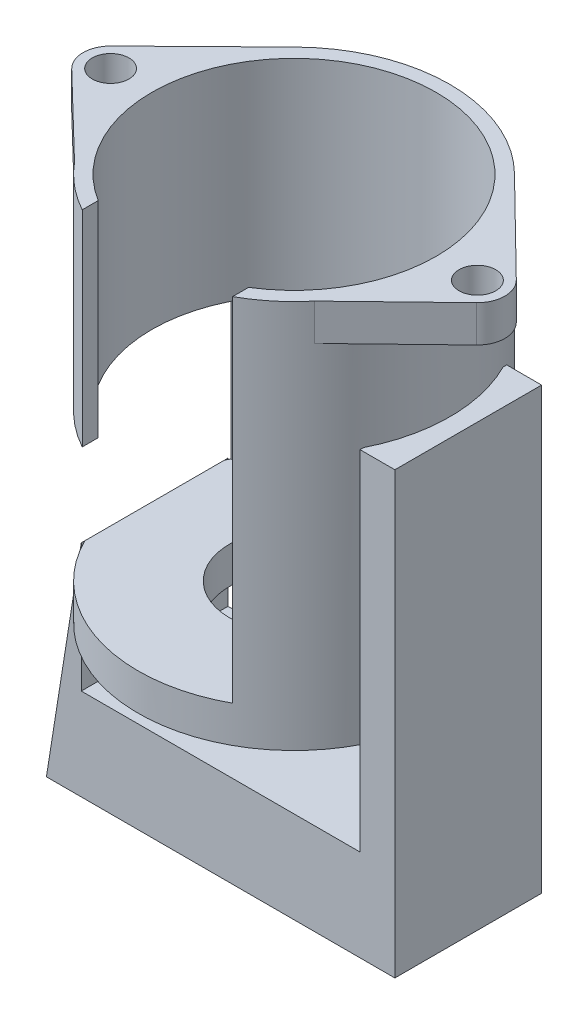
ISO-10303-21;
HEADER;
FILE_DESCRIPTION(('STEP AP214'),'2;1');
FILE_NAME('part.step','',(''),(''),'','','');
FILE_SCHEMA(('AUTOMOTIVE_DESIGN { 1 0 10303 214 1 1 1 1 }'));
ENDSEC;
DATA;
#1=APPLICATION_CONTEXT('core data for automotive mechanical design processes');
#2=APPLICATION_PROTOCOL_DEFINITION('international standard','automotive_design',2000,#1);
#3=PRODUCT_CONTEXT('',#1,'mechanical');
#4=PRODUCT('Part','Part','',(#3));
#5=PRODUCT_RELATED_PRODUCT_CATEGORY('part','',(#4));
#6=PRODUCT_DEFINITION_FORMATION('','',#4);
#7=PRODUCT_DEFINITION_CONTEXT('part definition',#1,'design');
#8=PRODUCT_DEFINITION('design','',#6,#7);
#9=PRODUCT_DEFINITION_SHAPE('','',#8);
#10=(LENGTH_UNIT() NAMED_UNIT(*) SI_UNIT(.MILLI.,.METRE.));
#11=(NAMED_UNIT(*) PLANE_ANGLE_UNIT() SI_UNIT($,.RADIAN.));
#12=(NAMED_UNIT(*) SI_UNIT($,.STERADIAN.) SOLID_ANGLE_UNIT());
#13=UNCERTAINTY_MEASURE_WITH_UNIT(LENGTH_MEASURE(1.E-05),#10,'distance_accuracy_value','');
#14=(GEOMETRIC_REPRESENTATION_CONTEXT(3) GLOBAL_UNCERTAINTY_ASSIGNED_CONTEXT((#13)) GLOBAL_UNIT_ASSIGNED_CONTEXT((#10,
#11,#12)) REPRESENTATION_CONTEXT('',''));
#15=CARTESIAN_POINT('',(0.,0.,0.));
#16=DIRECTION('',(0.,0.,1.));
#17=DIRECTION('',(1.,0.,0.));
#18=AXIS2_PLACEMENT_3D('',#15,#16,#17);
#19=CARTESIAN_POINT('',(0.,22.201,0.));
#20=DIRECTION('',(0.,-1.,0.));
#21=DIRECTION('',(0.,0.,-1.));
#22=AXIS2_PLACEMENT_3D('',#19,#20,#21);
#23=CYLINDRICAL_SURFACE('',#22,7.75);
#24=CARTESIAN_POINT('',(0.,1.,0.));
#25=DIRECTION('',(0.,1.,0.));
#26=DIRECTION('',(0.,0.,1.));
#27=AXIS2_PLACEMENT_3D('',#24,#25,#26);
#28=CIRCLE('',#27,7.75);
#29=CARTESIAN_POINT('',(-7.5,1.,-1.95256241897666));
#30=VERTEX_POINT('',#29);
#31=CARTESIAN_POINT('',(-7.5,1.,1.95256241897666));
#32=VERTEX_POINT('',#31);
#33=EDGE_CURVE('E255',#30,#32,#28,.T.);
#34=ORIENTED_EDGE('',*,*,#33,.T.);
#35=DIRECTION('',(0.,-1.,0.));
#36=VECTOR('',#35,1.);
#37=CARTESIAN_POINT('',(-7.5,22.201,1.95256241897666));
#38=LINE('',#37,#36);
#39=CARTESIAN_POINT('',(-7.5,0.,1.95256241897666));
#40=VERTEX_POINT('',#39);
#41=EDGE_CURVE('E292',#32,#40,#38,.T.);
#42=ORIENTED_EDGE('',*,*,#41,.T.);
#43=CARTESIAN_POINT('',(0.,0.,0.));
#44=DIRECTION('',(0.,1.,0.));
#45=DIRECTION('',(0.,0.,1.));
#46=AXIS2_PLACEMENT_3D('',#43,#44,#45);
#47=CIRCLE('',#46,7.75);
#48=CARTESIAN_POINT('',(-7.6,0.,1.51739909054935));
#49=VERTEX_POINT('',#48);
#50=EDGE_CURVE('E556',#49,#40,#47,.T.);
#51=ORIENTED_EDGE('',*,*,#50,.F.);
#52=CARTESIAN_POINT('',(-7.6,0.,-1.51739909054935));
#53=VERTEX_POINT('',#52);
#54=EDGE_CURVE('E562',#53,#49,#47,.T.);
#55=ORIENTED_EDGE('',*,*,#54,.F.);
#56=CARTESIAN_POINT('',(-7.5,0.,-1.95256241897666));
#57=VERTEX_POINT('',#56);
#58=EDGE_CURVE('E561',#57,#53,#47,.T.);
#59=ORIENTED_EDGE('',*,*,#58,.F.);
#60=DIRECTION('',(0.,-1.,0.));
#61=VECTOR('',#60,1.);
#62=CARTESIAN_POINT('',(-7.5,22.201,-1.95256241897666));
#63=LINE('',#62,#61);
#64=EDGE_CURVE('E269',#57,#30,#63,.F.);
#65=ORIENTED_EDGE('',*,*,#64,.T.);
#66=EDGE_LOOP('',(#34,#42,#51,#55,#59,#65));
#67=FACE_BOUND('',#66,.T.);
#68=ADVANCED_FACE('F39',(#67),#23,.F.);
#69=CARTESIAN_POINT('',(0.,22.2,0.));
#70=DIRECTION('',(0.,-1.,0.));
#71=DIRECTION('',(0.,0.,-1.));
#72=AXIS2_PLACEMENT_3D('',#69,#70,#71);
#73=CYLINDRICAL_SURFACE('',#72,8.5);
#74=CARTESIAN_POINT('',(0.,1.,0.));
#75=DIRECTION('',(0.,1.,0.));
#76=DIRECTION('',(0.,0.,1.));
#77=AXIS2_PLACEMENT_3D('',#74,#75,#76);
#78=CIRCLE('',#77,8.5);
#79=CARTESIAN_POINT('',(-7.5,1.,4.));
#80=VERTEX_POINT('',#79);
#81=CARTESIAN_POINT('',(7.6,1.,3.80657326213486));
#82=VERTEX_POINT('',#81);
#83=EDGE_CURVE('E315',#80,#82,#78,.T.);
#84=ORIENTED_EDGE('',*,*,#83,.T.);
#85=DIRECTION('',(0.,-1.,0.));
#86=VECTOR('',#85,1.);
#87=CARTESIAN_POINT('',(7.6,15.,3.80657326213486));
#88=LINE('',#87,#86);
#89=CARTESIAN_POINT('',(7.6,15.,3.80657326213486));
#90=VERTEX_POINT('',#89);
#91=EDGE_CURVE('E370',#90,#82,#88,.T.);
#92=ORIENTED_EDGE('',*,*,#91,.F.);
#93=CARTESIAN_POINT('',(0.,15.,0.));
#94=DIRECTION('',(0.,-1.,0.));
#95=DIRECTION('',(0.,0.,1.));
#96=AXIS2_PLACEMENT_3D('',#93,#94,#95);
#97=CIRCLE('',#96,8.5);
#98=CARTESIAN_POINT('',(7.6,15.,-3.80657326213486));
#99=VERTEX_POINT('',#98);
#100=EDGE_CURVE('E334',#99,#90,#97,.T.);
#101=ORIENTED_EDGE('',*,*,#100,.F.);
#102=DIRECTION('',(0.,-1.,0.));
#103=VECTOR('',#102,1.);
#104=CARTESIAN_POINT('',(7.6,15.,-3.80657326213486));
#105=LINE('',#104,#103);
#106=CARTESIAN_POINT('',(7.6,1.,-3.80657326213486));
#107=VERTEX_POINT('',#106);
#108=EDGE_CURVE('E275',#99,#107,#105,.T.);
#109=ORIENTED_EDGE('',*,*,#108,.T.);
#110=CARTESIAN_POINT('',(0.,1.,0.));
#111=DIRECTION('',(0.,1.,0.));
#112=DIRECTION('',(0.,0.,1.));
#113=AXIS2_PLACEMENT_3D('',#110,#111,#112);
#114=CIRCLE('',#113,8.5);
#115=CARTESIAN_POINT('',(-7.5,1.,-4.));
#116=VERTEX_POINT('',#115);
#117=EDGE_CURVE('E251',#107,#116,#114,.T.);
#118=ORIENTED_EDGE('',*,*,#117,.T.);
#119=DIRECTION('',(0.,-1.,0.));
#120=VECTOR('',#119,1.);
#121=CARTESIAN_POINT('',(-7.5,1.,-4.));
#122=LINE('',#121,#120);
#123=CARTESIAN_POINT('',(-7.5,0.,-4.));
#124=VERTEX_POINT('',#123);
#125=EDGE_CURVE('E262',#116,#124,#122,.T.);
#126=ORIENTED_EDGE('',*,*,#125,.T.);
#127=CARTESIAN_POINT('',(0.,0.,0.));
#128=DIRECTION('',(0.,1.,0.));
#129=DIRECTION('',(0.,0.,1.));
#130=AXIS2_PLACEMENT_3D('',#127,#128,#129);
#131=CIRCLE('',#130,8.5);
#132=CARTESIAN_POINT('',(-7.6,0.,-3.80657326213486));
#133=VERTEX_POINT('',#132);
#134=EDGE_CURVE('E572',#124,#133,#131,.T.);
#135=ORIENTED_EDGE('',*,*,#134,.T.);
#136=DIRECTION('',(0.,-1.,0.));
#137=VECTOR('',#136,1.);
#138=CARTESIAN_POINT('',(-7.6,3.,-3.80657326213486));
#139=LINE('',#138,#137);
#140=CARTESIAN_POINT('',(-7.6,3.,-3.80657326213486));
#141=VERTEX_POINT('',#140);
#142=EDGE_CURVE('E383',#141,#133,#139,.T.);
#143=ORIENTED_EDGE('',*,*,#142,.F.);
#144=CARTESIAN_POINT('',(0.,3.,0.));
#145=DIRECTION('',(0.,-1.,0.));
#146=DIRECTION('',(0.,0.,-1.));
#147=AXIS2_PLACEMENT_3D('',#144,#145,#146);
#148=CIRCLE('',#147,8.5);
#149=CARTESIAN_POINT('',(-7.47411703846161,3.,-4.0481569257352));
#150=VERTEX_POINT('',#149);
#151=EDGE_CURVE('E392',#141,#150,#148,.T.);
#152=ORIENTED_EDGE('',*,*,#151,.T.);
#153=DIRECTION('',(0.,-1.,0.));
#154=VECTOR('',#153,1.);
#155=CARTESIAN_POINT('',(-7.47411703846161,22.2,-4.0481569257352));
#156=LINE('',#155,#154);
#157=CARTESIAN_POINT('',(-7.47411703846161,11.,-4.0481569257352));
#158=VERTEX_POINT('',#157);
#159=EDGE_CURVE('E48',#150,#158,#156,.F.);
#160=ORIENTED_EDGE('',*,*,#159,.T.);
#161=CARTESIAN_POINT('',(0.,11.,0.));
#162=DIRECTION('',(0.,1.,0.));
#163=DIRECTION('',(0.,0.,1.));
#164=AXIS2_PLACEMENT_3D('',#161,#162,#163);
#165=CIRCLE('',#164,8.5);
#166=CARTESIAN_POINT('',(-4.1,11.,7.44580418759452));
#167=VERTEX_POINT('',#166);
#168=EDGE_CURVE('E400',#158,#167,#165,.T.);
#169=ORIENTED_EDGE('',*,*,#168,.T.);
#170=DIRECTION('',(0.,-1.,0.));
#171=VECTOR('',#170,1.);
#172=CARTESIAN_POINT('',(-4.1,22.2,7.44580418759451));
#173=LINE('',#172,#171);
#174=CARTESIAN_POINT('',(-4.1,22.2,7.44580418759451));
#175=VERTEX_POINT('',#174);
#176=EDGE_CURVE('E415',#175,#167,#173,.T.);
#177=ORIENTED_EDGE('',*,*,#176,.F.);
#178=CARTESIAN_POINT('',(0.,22.2,0.));
#179=DIRECTION('',(0.,1.,0.));
#180=DIRECTION('',(0.,0.,1.));
#181=AXIS2_PLACEMENT_3D('',#178,#179,#180);
#182=CIRCLE('',#181,8.5);
#183=CARTESIAN_POINT('',(-6.54868791660348,22.2,5.41891931762521));
#184=VERTEX_POINT('',#183);
#185=EDGE_CURVE('E563',#184,#175,#182,.T.);
#186=ORIENTED_EDGE('',*,*,#185,.F.);
#187=DIRECTION('',(0.,1.,0.));
#188=VECTOR('',#187,1.);
#189=CARTESIAN_POINT('',(-6.54868791660351,20.2,5.41891931762517));
#190=LINE('',#189,#188);
#191=CARTESIAN_POINT('',(-6.54868791660351,20.2,5.41891931762517));
#192=VERTEX_POINT('',#191);
#193=EDGE_CURVE('E547',#192,#184,#190,.T.);
#194=ORIENTED_EDGE('',*,*,#193,.F.);
#195=CARTESIAN_POINT('',(0.,20.2,0.));
#196=DIRECTION('',(0.,1.,0.));
#197=DIRECTION('',(0.,0.,1.));
#198=AXIS2_PLACEMENT_3D('',#195,#196,#197);
#199=CIRCLE('',#198,8.5);
#200=CARTESIAN_POINT('',(-5.95,20.2,-6.07021416426142));
#201=VERTEX_POINT('',#200);
#202=EDGE_CURVE('E528',#201,#192,#199,.T.);
#203=ORIENTED_EDGE('',*,*,#202,.F.);
#204=DIRECTION('',(0.,1.,0.));
#205=VECTOR('',#204,1.);
#206=CARTESIAN_POINT('',(-5.95,20.2,-6.07021416426142));
#207=LINE('',#206,#205);
#208=CARTESIAN_POINT('',(-5.95,22.2,-6.07021416426142));
#209=VERTEX_POINT('',#208);
#210=EDGE_CURVE('E529',#201,#209,#207,.T.);
#211=ORIENTED_EDGE('',*,*,#210,.T.);
#212=CARTESIAN_POINT('',(5.94999999999996,22.2,-6.07021416426146));
#213=VERTEX_POINT('',#212);
#214=EDGE_CURVE('E567',#213,#209,#182,.T.);
#215=ORIENTED_EDGE('',*,*,#214,.F.);
#216=DIRECTION('',(0.,1.,0.));
#217=VECTOR('',#216,1.);
#218=CARTESIAN_POINT('',(5.94999999999996,20.2,-6.07021416426146));
#219=LINE('',#218,#217);
#220=CARTESIAN_POINT('',(5.94999999999996,20.2,-6.07021416426146));
#221=VERTEX_POINT('',#220);
#222=EDGE_CURVE('E533',#221,#213,#219,.T.);
#223=ORIENTED_EDGE('',*,*,#222,.F.);
#224=CARTESIAN_POINT('',(6.54868791660355,20.2,5.41891931762513));
#225=VERTEX_POINT('',#224);
#226=EDGE_CURVE('E555',#225,#221,#199,.T.);
#227=ORIENTED_EDGE('',*,*,#226,.F.);
#228=DIRECTION('',(0.,1.,0.));
#229=VECTOR('',#228,1.);
#230=CARTESIAN_POINT('',(6.54868791660355,20.2,5.41891931762513));
#231=LINE('',#230,#229);
#232=CARTESIAN_POINT('',(6.54868791660355,22.2,5.41891931762513));
#233=VERTEX_POINT('',#232);
#234=EDGE_CURVE('E543',#225,#233,#231,.T.);
#235=ORIENTED_EDGE('',*,*,#234,.T.);
#236=CARTESIAN_POINT('',(4.1,22.2,7.44580418759452));
#237=VERTEX_POINT('',#236);
#238=EDGE_CURVE('E568',#237,#233,#182,.T.);
#239=ORIENTED_EDGE('',*,*,#238,.F.);
#240=DIRECTION('',(0.,-1.,0.));
#241=VECTOR('',#240,1.);
#242=CARTESIAN_POINT('',(4.1,22.2,7.44580418759452));
#243=LINE('',#242,#241);
#244=CARTESIAN_POINT('',(4.1,3.,7.44580418759451));
#245=VERTEX_POINT('',#244);
#246=EDGE_CURVE('E63',#245,#237,#243,.F.);
#247=ORIENTED_EDGE('',*,*,#246,.F.);
#248=CARTESIAN_POINT('',(-7.6,3.,3.80657326213486));
#249=VERTEX_POINT('',#248);
#250=EDGE_CURVE('E396',#245,#249,#148,.T.);
#251=ORIENTED_EDGE('',*,*,#250,.T.);
#252=DIRECTION('',(0.,-1.,0.));
#253=VECTOR('',#252,1.);
#254=CARTESIAN_POINT('',(-7.6,3.,3.80657326213486));
#255=LINE('',#254,#253);
#256=CARTESIAN_POINT('',(-7.6,0.,3.80657326213486));
#257=VERTEX_POINT('',#256);
#258=EDGE_CURVE('E380',#249,#257,#255,.T.);
#259=ORIENTED_EDGE('',*,*,#258,.T.);
#260=CARTESIAN_POINT('',(-7.5,0.,4.));
#261=VERTEX_POINT('',#260);
#262=EDGE_CURVE('E560',#257,#261,#131,.T.);
#263=ORIENTED_EDGE('',*,*,#262,.T.);
#264=DIRECTION('',(0.,-1.,0.));
#265=VECTOR('',#264,1.);
#266=CARTESIAN_POINT('',(-7.5,1.,4.));
#267=LINE('',#266,#265);
#268=EDGE_CURVE('E55',#80,#261,#267,.T.);
#269=ORIENTED_EDGE('',*,*,#268,.F.);
#270=EDGE_LOOP('',(#84,#92,#101,#109,#118,#126,#135,#143,#152,#160,#169,#177,#186,#194,#203,
#211,#215,#223,#227,#235,#239,#247,#251,#259,#263,#269));
#271=FACE_BOUND('',#270,.T.);
#272=ADVANCED_FACE('F272',(#271),#73,.T.);
#273=CARTESIAN_POINT('',(0.,0.,0.));
#274=DIRECTION('',(0.,1.,0.));
#275=DIRECTION('',(0.,0.,1.));
#276=AXIS2_PLACEMENT_3D('',#273,#274,#275);
#277=PLANE('',#276);
#278=DIRECTION('',(0.,0.,1.));
#279=VECTOR('',#278,1.);
#280=CARTESIAN_POINT('',(-7.5,0.,4.));
#281=LINE('',#280,#279);
#282=EDGE_CURVE('E281',#40,#261,#281,.T.);
#283=ORIENTED_EDGE('',*,*,#282,.T.);
#284=ORIENTED_EDGE('',*,*,#262,.F.);
#285=DIRECTION('',(0.,0.,1.));
#286=VECTOR('',#285,1.);
#287=CARTESIAN_POINT('',(-7.6,0.,-4.));
#288=LINE('',#287,#286);
#289=EDGE_CURVE('E423',#49,#257,#288,.T.);
#290=ORIENTED_EDGE('',*,*,#289,.F.);
#291=ORIENTED_EDGE('',*,*,#50,.T.);
#292=EDGE_LOOP('',(#283,#284,#290,#291));
#293=FACE_BOUND('',#292,.T.);
#294=ADVANCED_FACE('F655',(#293),#277,.F.);
#295=EDGE_CURVE('E265',#124,#57,#281,.T.);
#296=ORIENTED_EDGE('',*,*,#295,.T.);
#297=ORIENTED_EDGE('',*,*,#58,.T.);
#298=EDGE_CURVE('E429',#133,#53,#288,.T.);
#299=ORIENTED_EDGE('',*,*,#298,.F.);
#300=ORIENTED_EDGE('',*,*,#134,.F.);
#301=EDGE_LOOP('',(#296,#297,#299,#300));
#302=FACE_BOUND('',#301,.T.);
#303=ADVANCED_FACE('F666',(#302),#277,.F.);
#304=CARTESIAN_POINT('',(-4.1,22.2,8.5));
#305=DIRECTION('',(1.,0.,0.));
#306=DIRECTION('',(0.,1.,0.));
#307=AXIS2_PLACEMENT_3D('',#304,#305,#306);
#308=PLANE('',#307);
#309=DIRECTION('',(0.,0.,1.));
#310=VECTOR('',#309,1.);
#311=CARTESIAN_POINT('',(-4.1,11.,8.5));
#312=LINE('',#311,#310);
#313=CARTESIAN_POINT('',(-4.1,11.,6.57666328771665));
#314=VERTEX_POINT('',#313);
#315=EDGE_CURVE('E608',#314,#167,#312,.T.);
#316=ORIENTED_EDGE('',*,*,#315,.F.);
#317=DIRECTION('',(0.,-1.,0.));
#318=VECTOR('',#317,1.);
#319=CARTESIAN_POINT('',(-4.1,22.201,6.57666328771665));
#320=LINE('',#319,#318);
#321=CARTESIAN_POINT('',(-4.1,22.2,6.57666328771665));
#322=VERTEX_POINT('',#321);
#323=EDGE_CURVE('E419',#322,#314,#320,.T.);
#324=ORIENTED_EDGE('',*,*,#323,.F.);
#325=DIRECTION('',(0.,0.,-1.));
#326=VECTOR('',#325,1.);
#327=CARTESIAN_POINT('',(-4.1,22.2,0.));
#328=LINE('',#327,#326);
#329=EDGE_CURVE('E604',#175,#322,#328,.T.);
#330=ORIENTED_EDGE('',*,*,#329,.F.);
#331=ORIENTED_EDGE('',*,*,#176,.T.);
#332=EDGE_LOOP('',(#316,#324,#330,#331));
#333=FACE_BOUND('',#332,.T.);
#334=ADVANCED_FACE('F636',(#333),#308,.T.);
#335=CARTESIAN_POINT('',(0.,3.,0.));
#336=DIRECTION('',(0.,1.,0.));
#337=DIRECTION('',(0.,0.,1.));
#338=AXIS2_PLACEMENT_3D('',#335,#336,#337);
#339=CIRCLE('',#338,7.75);
#340=CARTESIAN_POINT('',(4.1,3.,6.57666328771665));
#341=VERTEX_POINT('',#340);
#342=CARTESIAN_POINT('',(-6.60870074255312,3.,-4.0481569257352));
#343=VERTEX_POINT('',#342);
#344=EDGE_CURVE('E322',#341,#343,#339,.T.);
#345=ORIENTED_EDGE('',*,*,#344,.F.);
#346=DIRECTION('',(0.,-1.,0.));
#347=VECTOR('',#346,1.);
#348=CARTESIAN_POINT('',(4.1,22.201,6.57666328771665));
#349=LINE('',#348,#347);
#350=CARTESIAN_POINT('',(4.1,22.2,6.57666328771665));
#351=VERTEX_POINT('',#350);
#352=EDGE_CURVE('E412',#341,#351,#349,.F.);
#353=ORIENTED_EDGE('',*,*,#352,.T.);
#354=CARTESIAN_POINT('',(0.,22.2,0.));
#355=DIRECTION('',(0.,1.,0.));
#356=DIRECTION('',(0.,0.,1.));
#357=AXIS2_PLACEMENT_3D('',#354,#355,#356);
#358=CIRCLE('',#357,7.75);
#359=EDGE_CURVE('E448',#351,#322,#358,.T.);
#360=ORIENTED_EDGE('',*,*,#359,.T.);
#361=ORIENTED_EDGE('',*,*,#323,.T.);
#362=CARTESIAN_POINT('',(0.,11.,0.));
#363=DIRECTION('',(0.,1.,0.));
#364=DIRECTION('',(0.,0.,1.));
#365=AXIS2_PLACEMENT_3D('',#362,#363,#364);
#366=CIRCLE('',#365,7.75);
#367=CARTESIAN_POINT('',(-6.60870074255312,11.,-4.0481569257352));
#368=VERTEX_POINT('',#367);
#369=EDGE_CURVE('E404',#368,#314,#366,.T.);
#370=ORIENTED_EDGE('',*,*,#369,.F.);
#371=DIRECTION('',(0.,-1.,0.));
#372=VECTOR('',#371,1.);
#373=CARTESIAN_POINT('',(-6.60870074255312,22.201,-4.0481569257352));
#374=LINE('',#373,#372);
#375=EDGE_CURVE('E407',#343,#368,#374,.F.);
#376=ORIENTED_EDGE('',*,*,#375,.F.);
#377=EDGE_LOOP('',(#345,#353,#360,#361,#370,#376));
#378=FACE_BOUND('',#377,.T.);
#379=ADVANCED_FACE('F627',(#378),#23,.F.);
#380=CARTESIAN_POINT('',(0.,22.2,0.));
#381=DIRECTION('',(0.,1.,0.));
#382=DIRECTION('',(0.,0.,1.));
#383=AXIS2_PLACEMENT_3D('',#380,#381,#382);
#384=PLANE('',#383);
#385=CARTESIAN_POINT('',(-10.,22.2,0.));
#386=DIRECTION('',(0.,1.,0.));
#387=DIRECTION('',(0.,0.,1.));
#388=AXIS2_PLACEMENT_3D('',#385,#386,#387);
#389=CIRCLE('',#388,1.);
#390=CARTESIAN_POINT('',(-10.,22.2,1.));
#391=VERTEX_POINT('',#390);
#392=EDGE_CURVE('E467',#391,#391,#389,.T.);
#393=ORIENTED_EDGE('',*,*,#392,.F.);
#394=EDGE_LOOP('',(#393));
#395=FACE_BOUND('',#394,.T.);
#396=CARTESIAN_POINT('',(10.,22.2,0.));
#397=DIRECTION('',(0.,1.,0.));
#398=DIRECTION('',(0.,0.,-1.));
#399=AXIS2_PLACEMENT_3D('',#396,#397,#398);
#400=CIRCLE('',#399,1.);
#401=CARTESIAN_POINT('',(10.,22.2,-1.00000000000007));
#402=VERTEX_POINT('',#401);
#403=EDGE_CURVE('E462',#402,#402,#400,.T.);
#404=ORIENTED_EDGE('',*,*,#403,.F.);
#405=EDGE_LOOP('',(#404));
#406=FACE_BOUND('',#405,.T.);
#407=ORIENTED_EDGE('',*,*,#185,.T.);
#408=ORIENTED_EDGE('',*,*,#329,.T.);
#409=ORIENTED_EDGE('',*,*,#359,.F.);
#410=DIRECTION('',(0.,0.,1.));
#411=VECTOR('',#410,1.);
#412=CARTESIAN_POINT('',(4.1,22.2,0.));
#413=LINE('',#412,#411);
#414=EDGE_CURVE('E601',#351,#237,#413,.T.);
#415=ORIENTED_EDGE('',*,*,#414,.T.);
#416=ORIENTED_EDGE('',*,*,#238,.T.);
#417=DIRECTION('',(0.719277358310852,0.,-0.69472302525637));
#418=VECTOR('',#417,1.);
#419=CARTESIAN_POINT('',(11.0420845378846,22.2,1.07891603746628));
#420=LINE('',#419,#418);
#421=CARTESIAN_POINT('',(11.0420845378845,22.2,1.07891603746626));
#422=VERTEX_POINT('',#421);
#423=EDGE_CURVE('E511',#233,#422,#420,.T.);
#424=ORIENTED_EDGE('',*,*,#423,.T.);
#425=CARTESIAN_POINT('',(10.,22.2,0.));
#426=DIRECTION('',(0.,1.,0.));
#427=DIRECTION('',(0.,0.,-1.));
#428=AXIS2_PLACEMENT_3D('',#425,#426,#427);
#429=CIRCLE('',#428,1.50000000000002);
#430=CARTESIAN_POINT('',(11.05,22.2,-1.0712142642815));
#431=VERTEX_POINT('',#430);
#432=EDGE_CURVE('E515',#422,#431,#429,.T.);
#433=ORIENTED_EDGE('',*,*,#432,.T.);
#434=DIRECTION('',(-0.71414284285429,0.,-0.699999999999995));
#435=VECTOR('',#434,1.);
#436=CARTESIAN_POINT('',(11.05,22.2,-1.0712142642815));
#437=LINE('',#436,#435);
#438=EDGE_CURVE('E519',#431,#213,#437,.T.);
#439=ORIENTED_EDGE('',*,*,#438,.T.);
#440=ORIENTED_EDGE('',*,*,#214,.T.);
#441=DIRECTION('',(-0.714142842854285,0.,0.7));
#442=VECTOR('',#441,1.);
#443=CARTESIAN_POINT('',(-11.05,22.2,-1.07121426428143));
#444=LINE('',#443,#442);
#445=CARTESIAN_POINT('',(-11.05,22.2,-1.07121426428143));
#446=VERTEX_POINT('',#445);
#447=EDGE_CURVE('E484',#209,#446,#444,.T.);
#448=ORIENTED_EDGE('',*,*,#447,.T.);
#449=CARTESIAN_POINT('',(-10.,22.2,0.));
#450=DIRECTION('',(0.,1.,0.));
#451=DIRECTION('',(0.,0.,1.));
#452=AXIS2_PLACEMENT_3D('',#449,#450,#451);
#453=CIRCLE('',#452,1.5);
#454=CARTESIAN_POINT('',(-11.0420845378846,22.2,1.07891603746628));
#455=VERTEX_POINT('',#454);
#456=EDGE_CURVE('E475',#446,#455,#453,.T.);
#457=ORIENTED_EDGE('',*,*,#456,.T.);
#458=DIRECTION('',(0.719277358310851,0.,0.69472302525637));
#459=VECTOR('',#458,1.);
#460=CARTESIAN_POINT('',(-11.0420845378846,22.2,1.07891603746628));
#461=LINE('',#460,#459);
#462=EDGE_CURVE('E508',#455,#184,#461,.T.);
#463=ORIENTED_EDGE('',*,*,#462,.T.);
#464=EDGE_LOOP('',(#407,#408,#409,#415,#416,#424,#433,#439,#440,#448,#457,#463));
#465=FACE_BOUND('',#464,.T.);
#466=ADVANCED_FACE('F633',(#395,#406,#465),#384,.T.);
#467=CARTESIAN_POINT('',(0.,0.,0.));
#468=DIRECTION('',(0.,1.,0.));
#469=DIRECTION('',(0.,0.,1.));
#470=AXIS2_PLACEMENT_3D('',#467,#468,#469);
#471=PLANE('',#470);
#472=DIRECTION('',(0.,0.,-1.));
#473=VECTOR('',#472,1.);
#474=CARTESIAN_POINT('',(7.6,0.,0.));
#475=LINE('',#474,#473);
#476=CARTESIAN_POINT('',(7.6,0.,3.80657326213486));
#477=VERTEX_POINT('',#476);
#478=CARTESIAN_POINT('',(7.6,0.,-3.80657326213486));
#479=VERTEX_POINT('',#478);
#480=EDGE_CURVE('E598',#477,#479,#475,.T.);
#481=ORIENTED_EDGE('',*,*,#480,.F.);
#482=CARTESIAN_POINT('',(0.,0.,0.));
#483=DIRECTION('',(0.,1.,0.));
#484=DIRECTION('',(0.,0.,1.));
#485=AXIS2_PLACEMENT_3D('',#482,#483,#484);
#486=CIRCLE('',#485,8.5);
#487=EDGE_CURVE('E284',#477,#479,#486,.T.);
#488=ORIENTED_EDGE('',*,*,#487,.T.);
#489=EDGE_LOOP('',(#481,#488));
#490=FACE_BOUND('',#489,.T.);
#491=ADVANCED_FACE('F664',(#490),#471,.T.);
#492=CARTESIAN_POINT('',(9.50000000000001,-9.,-4.));
#493=DIRECTION('',(1.,0.,0.));
#494=DIRECTION('',(0.,0.,-1.));
#495=AXIS2_PLACEMENT_3D('',#492,#493,#494);
#496=PLANE('',#495);
#497=DIRECTION('',(0.,1.,0.));
#498=VECTOR('',#497,1.);
#499=CARTESIAN_POINT('',(9.50000000000001,-9.,-4.));
#500=LINE('',#499,#498);
#501=CARTESIAN_POINT('',(9.50000000000001,-9.,-4.));
#502=VERTEX_POINT('',#501);
#503=CARTESIAN_POINT('',(9.50000000000001,15.,-4.));
#504=VERTEX_POINT('',#503);
#505=EDGE_CURVE('E588',#502,#504,#500,.T.);
#506=ORIENTED_EDGE('',*,*,#505,.T.);
#507=DIRECTION('',(0.,0.,-1.));
#508=VECTOR('',#507,1.);
#509=CARTESIAN_POINT('',(9.50000000000001,15.,4.));
#510=LINE('',#509,#508);
#511=CARTESIAN_POINT('',(9.50000000000001,15.,4.));
#512=VERTEX_POINT('',#511);
#513=EDGE_CURVE('E357',#512,#504,#510,.T.);
#514=ORIENTED_EDGE('',*,*,#513,.F.);
#515=DIRECTION('',(0.,1.,0.));
#516=VECTOR('',#515,1.);
#517=CARTESIAN_POINT('',(9.50000000000001,-9.,4.));
#518=LINE('',#517,#516);
#519=CARTESIAN_POINT('',(9.50000000000001,-9.,4.));
#520=VERTEX_POINT('',#519);
#521=EDGE_CURVE('E589',#520,#512,#518,.T.);
#522=ORIENTED_EDGE('',*,*,#521,.F.);
#523=DIRECTION('',(0.,0.,-1.));
#524=VECTOR('',#523,1.);
#525=CARTESIAN_POINT('',(9.50000000000001,-9.,-4.));
#526=LINE('',#525,#524);
#527=EDGE_CURVE('E573',#520,#502,#526,.T.);
#528=ORIENTED_EDGE('',*,*,#527,.T.);
#529=EDGE_LOOP('',(#506,#514,#522,#528));
#530=FACE_BOUND('',#529,.T.);
#531=ADVANCED_FACE('F41',(#530),#496,.T.);
#532=CARTESIAN_POINT('',(-9.5,-9.,4.));
#533=DIRECTION('',(0.,0.,1.));
#534=DIRECTION('',(1.,0.,0.));
#535=AXIS2_PLACEMENT_3D('',#532,#533,#534);
#536=PLANE('',#535);
#537=DIRECTION('',(0.156385221956874,0.987696138674997,0.));
#538=VECTOR('',#537,1.);
#539=CARTESIAN_POINT('',(-9.5,-9.,4.));
#540=LINE('',#539,#538);
#541=CARTESIAN_POINT('',(-9.5,-9.,4.));
#542=VERTEX_POINT('',#541);
#543=CARTESIAN_POINT('',(-7.6,3.,4.));
#544=VERTEX_POINT('',#543);
#545=EDGE_CURVE('E307',#542,#544,#540,.T.);
#546=ORIENTED_EDGE('',*,*,#545,.F.);
#547=DIRECTION('',(1.,0.,0.));
#548=VECTOR('',#547,1.);
#549=CARTESIAN_POINT('',(-9.5,-9.,4.));
#550=LINE('',#549,#548);
#551=EDGE_CURVE('E584',#542,#520,#550,.T.);
#552=ORIENTED_EDGE('',*,*,#551,.T.);
#553=ORIENTED_EDGE('',*,*,#521,.T.);
#554=DIRECTION('',(1.,0.,0.));
#555=VECTOR('',#554,1.);
#556=CARTESIAN_POINT('',(7.6,15.,4.));
#557=LINE('',#556,#555);
#558=CARTESIAN_POINT('',(7.6,15.,4.));
#559=VERTEX_POINT('',#558);
#560=EDGE_CURVE('E353',#559,#512,#557,.T.);
#561=ORIENTED_EDGE('',*,*,#560,.F.);
#562=DIRECTION('',(0.,1.,0.));
#563=VECTOR('',#562,1.);
#564=CARTESIAN_POINT('',(7.6,-4.,4.));
#565=LINE('',#564,#563);
#566=CARTESIAN_POINT('',(7.6,-4.,4.));
#567=VERTEX_POINT('',#566);
#568=EDGE_CURVE('E445',#567,#559,#565,.T.);
#569=ORIENTED_EDGE('',*,*,#568,.F.);
#570=DIRECTION('',(1.,0.,0.));
#571=VECTOR('',#570,1.);
#572=CARTESIAN_POINT('',(-7.6,-4.,4.));
#573=LINE('',#572,#571);
#574=CARTESIAN_POINT('',(-7.6,-4.,4.));
#575=VERTEX_POINT('',#574);
#576=EDGE_CURVE('E437',#575,#567,#573,.T.);
#577=ORIENTED_EDGE('',*,*,#576,.F.);
#578=DIRECTION('',(0.,1.,0.));
#579=VECTOR('',#578,1.);
#580=CARTESIAN_POINT('',(-7.6,-4.,4.));
#581=LINE('',#580,#579);
#582=EDGE_CURVE('E449',#575,#544,#581,.T.);
#583=ORIENTED_EDGE('',*,*,#582,.T.);
#584=EDGE_LOOP('',(#546,#552,#553,#561,#569,#577,#583));
#585=FACE_BOUND('',#584,.T.);
#586=ADVANCED_FACE('F739',(#585),#536,.T.);
#587=CARTESIAN_POINT('',(-9.5,-9.,-4.));
#588=DIRECTION('',(0.,0.,-1.));
#589=DIRECTION('',(-1.,0.,0.));
#590=AXIS2_PLACEMENT_3D('',#587,#588,#589);
#591=PLANE('',#590);
#592=DIRECTION('',(-0.156385221956874,-0.987696138674997,0.));
#593=VECTOR('',#592,1.);
#594=CARTESIAN_POINT('',(-9.5,-9.,-4.));
#595=LINE('',#594,#593);
#596=CARTESIAN_POINT('',(-7.6,3.,-4.));
#597=VERTEX_POINT('',#596);
#598=CARTESIAN_POINT('',(-9.5,-9.,-4.));
#599=VERTEX_POINT('',#598);
#600=EDGE_CURVE('E304',#597,#599,#595,.T.);
#601=ORIENTED_EDGE('',*,*,#600,.F.);
#602=DIRECTION('',(0.,1.,0.));
#603=VECTOR('',#602,1.);
#604=CARTESIAN_POINT('',(-7.6,-4.,-4.));
#605=LINE('',#604,#603);
#606=CARTESIAN_POINT('',(-7.6,-4.,-4.));
#607=VERTEX_POINT('',#606);
#608=EDGE_CURVE('E453',#607,#597,#605,.T.);
#609=ORIENTED_EDGE('',*,*,#608,.F.);
#610=DIRECTION('',(-1.,0.,0.));
#611=VECTOR('',#610,1.);
#612=CARTESIAN_POINT('',(-7.6,-4.,-4.));
#613=LINE('',#612,#611);
#614=CARTESIAN_POINT('',(7.6,-4.,-4.));
#615=VERTEX_POINT('',#614);
#616=EDGE_CURVE('E428',#615,#607,#613,.T.);
#617=ORIENTED_EDGE('',*,*,#616,.F.);
#618=DIRECTION('',(0.,1.,0.));
#619=VECTOR('',#618,1.);
#620=CARTESIAN_POINT('',(7.6,-4.,-4.));
#621=LINE('',#620,#619);
#622=CARTESIAN_POINT('',(7.6,15.,-4.));
#623=VERTEX_POINT('',#622);
#624=EDGE_CURVE('E441',#615,#623,#621,.T.);
#625=ORIENTED_EDGE('',*,*,#624,.T.);
#626=DIRECTION('',(-1.,0.,0.));
#627=VECTOR('',#626,1.);
#628=CARTESIAN_POINT('',(9.50000000000001,15.,-4.));
#629=LINE('',#628,#627);
#630=EDGE_CURVE('E361',#504,#623,#629,.T.);
#631=ORIENTED_EDGE('',*,*,#630,.F.);
#632=ORIENTED_EDGE('',*,*,#505,.F.);
#633=DIRECTION('',(-1.,0.,0.));
#634=VECTOR('',#633,1.);
#635=CARTESIAN_POINT('',(-9.5,-9.,-4.));
#636=LINE('',#635,#634);
#637=EDGE_CURVE('E577',#502,#599,#636,.T.);
#638=ORIENTED_EDGE('',*,*,#637,.T.);
#639=EDGE_LOOP('',(#601,#609,#617,#625,#631,#632,#638));
#640=FACE_BOUND('',#639,.T.);
#641=ADVANCED_FACE('F730',(#640),#591,.T.);
#642=CARTESIAN_POINT('',(0.,-9.,0.));
#643=DIRECTION('',(0.,1.,0.));
#644=DIRECTION('',(0.,0.,1.));
#645=AXIS2_PLACEMENT_3D('',#642,#643,#644);
#646=PLANE('',#645);
#647=CARTESIAN_POINT('',(-6.,-9.,0.));
#648=DIRECTION('',(0.,1.,0.));
#649=DIRECTION('',(0.,0.,1.));
#650=AXIS2_PLACEMENT_3D('',#647,#648,#649);
#651=CIRCLE('',#650,1.);
#652=CARTESIAN_POINT('',(-6.,-9.,1.));
#653=VERTEX_POINT('',#652);
#654=EDGE_CURVE('E330',#653,#653,#651,.T.);
#655=ORIENTED_EDGE('',*,*,#654,.T.);
#656=EDGE_LOOP('',(#655));
#657=FACE_BOUND('',#656,.T.);
#658=CARTESIAN_POINT('',(6.,-9.,0.));
#659=DIRECTION('',(0.,1.,0.));
#660=DIRECTION('',(0.,0.,-1.));
#661=AXIS2_PLACEMENT_3D('',#658,#659,#660);
#662=CIRCLE('',#661,0.999999999999998);
#663=CARTESIAN_POINT('',(6.,-9.,-0.999999999999997));
#664=VERTEX_POINT('',#663);
#665=EDGE_CURVE('E339',#664,#664,#662,.T.);
#666=ORIENTED_EDGE('',*,*,#665,.T.);
#667=EDGE_LOOP('',(#666));
#668=FACE_BOUND('',#667,.T.);
#669=ORIENTED_EDGE('',*,*,#527,.F.);
#670=ORIENTED_EDGE('',*,*,#551,.F.);
#671=DIRECTION('',(0.,0.,1.));
#672=VECTOR('',#671,1.);
#673=CARTESIAN_POINT('',(-9.5,-9.,-4.));
#674=LINE('',#673,#672);
#675=EDGE_CURVE('E581',#599,#542,#674,.T.);
#676=ORIENTED_EDGE('',*,*,#675,.F.);
#677=ORIENTED_EDGE('',*,*,#637,.F.);
#678=EDGE_LOOP('',(#669,#670,#676,#677));
#679=FACE_BOUND('',#678,.T.);
#680=ADVANCED_FACE('F725',(#657,#668,#679),#646,.F.);
#681=DIRECTION('',(0.,0.,1.));
#682=VECTOR('',#681,1.);
#683=CARTESIAN_POINT('',(-7.6,0.,0.));
#684=LINE('',#683,#682);
#685=EDGE_CURVE('E594',#53,#49,#684,.T.);
#686=ORIENTED_EDGE('',*,*,#685,.F.);
#687=ORIENTED_EDGE('',*,*,#54,.T.);
#688=EDGE_LOOP('',(#686,#687));
#689=FACE_BOUND('',#688,.T.);
#690=ADVANCED_FACE('F696',(#689),#471,.T.);
#691=CARTESIAN_POINT('',(-10.,20.2,0.));
#692=DIRECTION('',(0.,1.,0.));
#693=DIRECTION('',(0.,0.,1.));
#694=AXIS2_PLACEMENT_3D('',#691,#692,#693);
#695=CYLINDRICAL_SURFACE('',#694,1.);
#696=CARTESIAN_POINT('',(-10.,20.2,0.));
#697=DIRECTION('',(0.,1.,0.));
#698=DIRECTION('',(0.,0.,1.));
#699=AXIS2_PLACEMENT_3D('',#696,#697,#698);
#700=CIRCLE('',#699,1.);
#701=CARTESIAN_POINT('',(-10.,20.2,1.));
#702=VERTEX_POINT('',#701);
#703=EDGE_CURVE('E471',#702,#702,#700,.T.);
#704=ORIENTED_EDGE('',*,*,#703,.F.);
#705=EDGE_LOOP('',(#704));
#706=FACE_BOUND('',#705,.T.);
#707=ORIENTED_EDGE('',*,*,#392,.T.);
#708=EDGE_LOOP('',(#707));
#709=FACE_BOUND('',#708,.T.);
#710=ADVANCED_FACE('F692',(#706,#709),#695,.F.);
#711=CARTESIAN_POINT('',(-10.,20.2,0.));
#712=DIRECTION('',(0.,1.,0.));
#713=DIRECTION('',(0.,0.,1.));
#714=AXIS2_PLACEMENT_3D('',#711,#712,#713);
#715=CYLINDRICAL_SURFACE('',#714,1.5);
#716=ORIENTED_EDGE('',*,*,#456,.F.);
#717=DIRECTION('',(0.,1.,0.));
#718=VECTOR('',#717,1.);
#719=CARTESIAN_POINT('',(-11.05,20.2,-1.07121426428143));
#720=LINE('',#719,#718);
#721=CARTESIAN_POINT('',(-11.05,20.2,-1.07121426428143));
#722=VERTEX_POINT('',#721);
#723=EDGE_CURVE('E525',#722,#446,#720,.T.);
#724=ORIENTED_EDGE('',*,*,#723,.F.);
#725=CARTESIAN_POINT('',(-10.,20.2,0.));
#726=DIRECTION('',(0.,1.,0.));
#727=DIRECTION('',(0.,0.,1.));
#728=AXIS2_PLACEMENT_3D('',#725,#726,#727);
#729=CIRCLE('',#728,1.5);
#730=CARTESIAN_POINT('',(-11.0420845378846,20.2,1.07891603746628));
#731=VERTEX_POINT('',#730);
#732=EDGE_CURVE('E479',#722,#731,#729,.T.);
#733=ORIENTED_EDGE('',*,*,#732,.T.);
#734=DIRECTION('',(0.,1.,0.));
#735=VECTOR('',#734,1.);
#736=CARTESIAN_POINT('',(-11.0420845378846,20.2,1.07891603746628));
#737=LINE('',#736,#735);
#738=EDGE_CURVE('E504',#731,#455,#737,.T.);
#739=ORIENTED_EDGE('',*,*,#738,.T.);
#740=EDGE_LOOP('',(#716,#724,#733,#739));
#741=FACE_BOUND('',#740,.T.);
#742=ADVANCED_FACE('F695',(#741),#715,.T.);
#743=CARTESIAN_POINT('',(-10.,20.2,0.));
#744=DIRECTION('',(0.,1.,0.));
#745=DIRECTION('',(0.,0.,1.));
#746=AXIS2_PLACEMENT_3D('',#743,#744,#745);
#747=PLANE('',#746);
#748=ORIENTED_EDGE('',*,*,#703,.T.);
#749=EDGE_LOOP('',(#748));
#750=FACE_BOUND('',#749,.T.);
#751=DIRECTION('',(-0.714142842854285,0.,0.7));
#752=VECTOR('',#751,1.);
#753=CARTESIAN_POINT('',(-11.05,20.2,-1.07121426428143));
#754=LINE('',#753,#752);
#755=EDGE_CURVE('E500',#201,#722,#754,.T.);
#756=ORIENTED_EDGE('',*,*,#755,.F.);
#757=ORIENTED_EDGE('',*,*,#202,.T.);
#758=DIRECTION('',(0.719277358310851,0.,0.69472302525637));
#759=VECTOR('',#758,1.);
#760=CARTESIAN_POINT('',(-11.0420845378846,20.2,1.07891603746628));
#761=LINE('',#760,#759);
#762=EDGE_CURVE('E483',#731,#192,#761,.T.);
#763=ORIENTED_EDGE('',*,*,#762,.F.);
#764=ORIENTED_EDGE('',*,*,#732,.F.);
#765=EDGE_LOOP('',(#756,#757,#763,#764));
#766=FACE_BOUND('',#765,.T.);
#767=ADVANCED_FACE('F698',(#750,#766),#747,.F.);
#768=CARTESIAN_POINT('',(-11.0420845378846,20.2,1.07891603746628));
#769=DIRECTION('',(-0.69472302525637,0.,0.719277358310851));
#770=DIRECTION('',(0.719277358310851,0.,0.69472302525637));
#771=AXIS2_PLACEMENT_3D('',#768,#769,#770);
#772=PLANE('',#771);
#773=ORIENTED_EDGE('',*,*,#462,.F.);
#774=ORIENTED_EDGE('',*,*,#738,.F.);
#775=ORIENTED_EDGE('',*,*,#762,.T.);
#776=ORIENTED_EDGE('',*,*,#193,.T.);
#777=EDGE_LOOP('',(#773,#774,#775,#776));
#778=FACE_BOUND('',#777,.T.);
#779=ADVANCED_FACE('F701',(#778),#772,.T.);
#780=CARTESIAN_POINT('',(-11.05,20.2,-1.07121426428143));
#781=DIRECTION('',(-0.7,0.,-0.714142842854285));
#782=DIRECTION('',(-0.714142842854285,0.,0.7));
#783=AXIS2_PLACEMENT_3D('',#780,#781,#782);
#784=PLANE('',#783);
#785=ORIENTED_EDGE('',*,*,#447,.F.);
#786=ORIENTED_EDGE('',*,*,#210,.F.);
#787=ORIENTED_EDGE('',*,*,#755,.T.);
#788=ORIENTED_EDGE('',*,*,#723,.T.);
#789=EDGE_LOOP('',(#785,#786,#787,#788));
#790=FACE_BOUND('',#789,.T.);
#791=ADVANCED_FACE('F704',(#790),#784,.T.);
#792=CARTESIAN_POINT('',(10.,20.2,0.));
#793=DIRECTION('',(0.,1.,0.));
#794=DIRECTION('',(0.,0.,-1.));
#795=AXIS2_PLACEMENT_3D('',#792,#793,#794);
#796=CIRCLE('',#795,1.);
#797=CARTESIAN_POINT('',(10.,20.2,-1.00000000000007));
#798=VERTEX_POINT('',#797);
#799=EDGE_CURVE('E463',#798,#798,#796,.T.);
#800=ORIENTED_EDGE('',*,*,#799,.T.);
#801=EDGE_LOOP('',(#800));
#802=FACE_BOUND('',#801,.T.);
#803=DIRECTION('',(0.719277358310852,0.,-0.69472302525637));
#804=VECTOR('',#803,1.);
#805=CARTESIAN_POINT('',(11.0420845378846,20.2,1.07891603746628));
#806=LINE('',#805,#804);
#807=CARTESIAN_POINT('',(11.0420845378845,20.2,1.07891603746626));
#808=VERTEX_POINT('',#807);
#809=EDGE_CURVE('E488',#225,#808,#806,.T.);
#810=ORIENTED_EDGE('',*,*,#809,.F.);
#811=ORIENTED_EDGE('',*,*,#226,.T.);
#812=DIRECTION('',(-0.71414284285429,0.,-0.699999999999995));
#813=VECTOR('',#812,1.);
#814=CARTESIAN_POINT('',(11.05,20.2,-1.0712142642815));
#815=LINE('',#814,#813);
#816=CARTESIAN_POINT('',(11.05,20.2,-1.0712142642815));
#817=VERTEX_POINT('',#816);
#818=EDGE_CURVE('E496',#817,#221,#815,.T.);
#819=ORIENTED_EDGE('',*,*,#818,.F.);
#820=CARTESIAN_POINT('',(10.,20.2,0.));
#821=DIRECTION('',(0.,1.,0.));
#822=DIRECTION('',(0.,0.,-1.));
#823=AXIS2_PLACEMENT_3D('',#820,#821,#822);
#824=CIRCLE('',#823,1.50000000000002);
#825=EDGE_CURVE('E492',#808,#817,#824,.T.);
#826=ORIENTED_EDGE('',*,*,#825,.F.);
#827=EDGE_LOOP('',(#810,#811,#819,#826));
#828=FACE_BOUND('',#827,.T.);
#829=ADVANCED_FACE('F703',(#802,#828),#747,.F.);
#830=CARTESIAN_POINT('',(11.05,20.2,-1.0712142642815));
#831=DIRECTION('',(0.699999999999995,0.,-0.71414284285429));
#832=DIRECTION('',(-0.71414284285429,0.,-0.699999999999995));
#833=AXIS2_PLACEMENT_3D('',#830,#831,#832);
#834=PLANE('',#833);
#835=ORIENTED_EDGE('',*,*,#438,.F.);
#836=DIRECTION('',(0.,1.,0.));
#837=VECTOR('',#836,1.);
#838=CARTESIAN_POINT('',(11.05,20.2,-1.0712142642815));
#839=LINE('',#838,#837);
#840=EDGE_CURVE('E537',#817,#431,#839,.T.);
#841=ORIENTED_EDGE('',*,*,#840,.F.);
#842=ORIENTED_EDGE('',*,*,#818,.T.);
#843=ORIENTED_EDGE('',*,*,#222,.T.);
#844=EDGE_LOOP('',(#835,#841,#842,#843));
#845=FACE_BOUND('',#844,.T.);
#846=ADVANCED_FACE('F708',(#845),#834,.T.);
#847=CARTESIAN_POINT('',(10.,20.2,0.));
#848=DIRECTION('',(0.,1.,0.));
#849=DIRECTION('',(0.,0.,1.));
#850=AXIS2_PLACEMENT_3D('',#847,#848,#849);
#851=CYLINDRICAL_SURFACE('',#850,1.50000000000002);
#852=ORIENTED_EDGE('',*,*,#432,.F.);
#853=DIRECTION('',(0.,1.,0.));
#854=VECTOR('',#853,1.);
#855=CARTESIAN_POINT('',(11.0420845378845,20.2,1.07891603746626));
#856=LINE('',#855,#854);
#857=EDGE_CURVE('E540',#808,#422,#856,.T.);
#858=ORIENTED_EDGE('',*,*,#857,.F.);
#859=ORIENTED_EDGE('',*,*,#825,.T.);
#860=ORIENTED_EDGE('',*,*,#840,.T.);
#861=EDGE_LOOP('',(#852,#858,#859,#860));
#862=FACE_BOUND('',#861,.T.);
#863=ADVANCED_FACE('F711',(#862),#851,.T.);
#864=CARTESIAN_POINT('',(11.0420845378846,20.2,1.07891603746628));
#865=DIRECTION('',(0.69472302525637,0.,0.719277358310852));
#866=DIRECTION('',(0.719277358310852,0.,-0.69472302525637));
#867=AXIS2_PLACEMENT_3D('',#864,#865,#866);
#868=PLANE('',#867);
#869=ORIENTED_EDGE('',*,*,#423,.F.);
#870=ORIENTED_EDGE('',*,*,#234,.F.);
#871=ORIENTED_EDGE('',*,*,#809,.T.);
#872=ORIENTED_EDGE('',*,*,#857,.T.);
#873=EDGE_LOOP('',(#869,#870,#871,#872));
#874=FACE_BOUND('',#873,.T.);
#875=ADVANCED_FACE('F690',(#874),#868,.T.);
#876=CARTESIAN_POINT('',(10.,20.2,0.));
#877=DIRECTION('',(0.,1.,0.));
#878=DIRECTION('',(0.,0.,1.));
#879=AXIS2_PLACEMENT_3D('',#876,#877,#878);
#880=CYLINDRICAL_SURFACE('',#879,1.);
#881=ORIENTED_EDGE('',*,*,#799,.F.);
#882=EDGE_LOOP('',(#881));
#883=FACE_BOUND('',#882,.T.);
#884=ORIENTED_EDGE('',*,*,#403,.T.);
#885=EDGE_LOOP('',(#884));
#886=FACE_BOUND('',#885,.T.);
#887=ADVANCED_FACE('F686',(#883,#886),#880,.F.);
#888=CARTESIAN_POINT('',(7.6,-4.,-4.));
#889=DIRECTION('',(1.,0.,0.));
#890=DIRECTION('',(0.,0.,-1.));
#891=AXIS2_PLACEMENT_3D('',#888,#889,#890);
#892=PLANE('',#891);
#893=ORIENTED_EDGE('',*,*,#568,.T.);
#894=DIRECTION('',(0.,0.,1.));
#895=VECTOR('',#894,1.);
#896=CARTESIAN_POINT('',(7.6,15.,3.80657326213486));
#897=LINE('',#896,#895);
#898=EDGE_CURVE('E349',#90,#559,#897,.T.);
#899=ORIENTED_EDGE('',*,*,#898,.F.);
#900=ORIENTED_EDGE('',*,*,#91,.T.);
#901=DIRECTION('',(0.,-1.,0.));
#902=VECTOR('',#901,1.);
#903=CARTESIAN_POINT('',(7.6,1.,3.80657326213486));
#904=LINE('',#903,#902);
#905=EDGE_CURVE('E300',#477,#82,#904,.F.);
#906=ORIENTED_EDGE('',*,*,#905,.F.);
#907=ORIENTED_EDGE('',*,*,#480,.T.);
#908=DIRECTION('',(0.,-1.,0.));
#909=VECTOR('',#908,1.);
#910=CARTESIAN_POINT('',(7.6,1.,-3.80657326213486));
#911=LINE('',#910,#909);
#912=EDGE_CURVE('E296',#107,#479,#911,.T.);
#913=ORIENTED_EDGE('',*,*,#912,.F.);
#914=ORIENTED_EDGE('',*,*,#108,.F.);
#915=DIRECTION('',(0.,0.,1.));
#916=VECTOR('',#915,1.);
#917=CARTESIAN_POINT('',(7.6,15.,-4.));
#918=LINE('',#917,#916);
#919=EDGE_CURVE('E365',#623,#99,#918,.T.);
#920=ORIENTED_EDGE('',*,*,#919,.F.);
#921=ORIENTED_EDGE('',*,*,#624,.F.);
#922=DIRECTION('',(0.,0.,-1.));
#923=VECTOR('',#922,1.);
#924=CARTESIAN_POINT('',(7.6,-4.,-4.));
#925=LINE('',#924,#923);
#926=EDGE_CURVE('E424',#567,#615,#925,.T.);
#927=ORIENTED_EDGE('',*,*,#926,.F.);
#928=EDGE_LOOP('',(#893,#899,#900,#906,#907,#913,#914,#920,#921,#927));
#929=FACE_BOUND('',#928,.T.);
#930=ADVANCED_FACE('F682',(#929),#892,.F.);
#931=CARTESIAN_POINT('',(-7.6,-4.,-4.));
#932=DIRECTION('',(-1.,0.,0.));
#933=DIRECTION('',(0.,0.,1.));
#934=AXIS2_PLACEMENT_3D('',#931,#932,#933);
#935=PLANE('',#934);
#936=ORIENTED_EDGE('',*,*,#608,.T.);
#937=DIRECTION('',(0.,0.,-1.));
#938=VECTOR('',#937,1.);
#939=CARTESIAN_POINT('',(-7.6,3.,-3.80657326213486));
#940=LINE('',#939,#938);
#941=EDGE_CURVE('E374',#141,#597,#940,.T.);
#942=ORIENTED_EDGE('',*,*,#941,.F.);
#943=ORIENTED_EDGE('',*,*,#142,.T.);
#944=ORIENTED_EDGE('',*,*,#298,.T.);
#945=ORIENTED_EDGE('',*,*,#685,.T.);
#946=ORIENTED_EDGE('',*,*,#289,.T.);
#947=ORIENTED_EDGE('',*,*,#258,.F.);
#948=DIRECTION('',(0.,0.,-1.));
#949=VECTOR('',#948,1.);
#950=CARTESIAN_POINT('',(-7.6,3.,4.));
#951=LINE('',#950,#949);
#952=EDGE_CURVE('E377',#544,#249,#951,.T.);
#953=ORIENTED_EDGE('',*,*,#952,.F.);
#954=ORIENTED_EDGE('',*,*,#582,.F.);
#955=DIRECTION('',(0.,0.,1.));
#956=VECTOR('',#955,1.);
#957=CARTESIAN_POINT('',(-7.6,-4.,-4.));
#958=LINE('',#957,#956);
#959=EDGE_CURVE('E433',#607,#575,#958,.T.);
#960=ORIENTED_EDGE('',*,*,#959,.F.);
#961=EDGE_LOOP('',(#936,#942,#943,#944,#945,#946,#947,#953,#954,#960));
#962=FACE_BOUND('',#961,.T.);
#963=ADVANCED_FACE('F678',(#962),#935,.F.);
#964=CARTESIAN_POINT('',(0.,-4.,0.));
#965=DIRECTION('',(0.,1.,0.));
#966=DIRECTION('',(0.,0.,1.));
#967=AXIS2_PLACEMENT_3D('',#964,#965,#966);
#968=PLANE('',#967);
#969=CARTESIAN_POINT('',(-6.,-4.,0.));
#970=DIRECTION('',(0.,1.,0.));
#971=DIRECTION('',(0.,0.,1.));
#972=AXIS2_PLACEMENT_3D('',#969,#970,#971);
#973=CIRCLE('',#972,1.);
#974=CARTESIAN_POINT('',(-6.,-4.,1.));
#975=VERTEX_POINT('',#974);
#976=EDGE_CURVE('E335',#975,#975,#973,.T.);
#977=ORIENTED_EDGE('',*,*,#976,.F.);
#978=EDGE_LOOP('',(#977));
#979=FACE_BOUND('',#978,.T.);
#980=CARTESIAN_POINT('',(6.,-4.,0.));
#981=DIRECTION('',(0.,1.,0.));
#982=DIRECTION('',(0.,0.,-1.));
#983=AXIS2_PLACEMENT_3D('',#980,#981,#982);
#984=CIRCLE('',#983,0.999999999999998);
#985=CARTESIAN_POINT('',(6.,-4.,-0.999999999999997));
#986=VERTEX_POINT('',#985);
#987=EDGE_CURVE('E329',#986,#986,#984,.T.);
#988=ORIENTED_EDGE('',*,*,#987,.F.);
#989=EDGE_LOOP('',(#988));
#990=FACE_BOUND('',#989,.T.);
#991=ORIENTED_EDGE('',*,*,#926,.T.);
#992=ORIENTED_EDGE('',*,*,#616,.T.);
#993=ORIENTED_EDGE('',*,*,#959,.T.);
#994=ORIENTED_EDGE('',*,*,#576,.T.);
#995=EDGE_LOOP('',(#991,#992,#993,#994));
#996=FACE_BOUND('',#995,.T.);
#997=ADVANCED_FACE('F675',(#979,#990,#996),#968,.T.);
#998=CARTESIAN_POINT('',(4.1,22.2,8.5));
#999=DIRECTION('',(-1.,0.,0.));
#1000=DIRECTION('',(0.,-1.,0.));
#1001=AXIS2_PLACEMENT_3D('',#998,#999,#1000);
#1002=PLANE('',#1001);
#1003=DIRECTION('',(0.,0.,-1.));
#1004=VECTOR('',#1003,1.);
#1005=CARTESIAN_POINT('',(4.1,3.,8.5));
#1006=LINE('',#1005,#1004);
#1007=EDGE_CURVE('E321',#245,#341,#1006,.T.);
#1008=ORIENTED_EDGE('',*,*,#1007,.F.);
#1009=ORIENTED_EDGE('',*,*,#246,.T.);
#1010=ORIENTED_EDGE('',*,*,#414,.F.);
#1011=ORIENTED_EDGE('',*,*,#352,.F.);
#1012=EDGE_LOOP('',(#1008,#1009,#1010,#1011));
#1013=FACE_BOUND('',#1012,.T.);
#1014=ADVANCED_FACE('F629',(#1013),#1002,.T.);
#1015=CARTESIAN_POINT('',(-11.5,11.,-4.0481569257352));
#1016=DIRECTION('',(0.,0.,-1.));
#1017=DIRECTION('',(0.,1.,0.));
#1018=AXIS2_PLACEMENT_3D('',#1015,#1016,#1017);
#1019=PLANE('',#1018);
#1020=ORIENTED_EDGE('',*,*,#375,.T.);
#1021=DIRECTION('',(1.,0.,0.));
#1022=VECTOR('',#1021,1.);
#1023=CARTESIAN_POINT('',(-11.5,11.,-4.0481569257352));
#1024=LINE('',#1023,#1022);
#1025=EDGE_CURVE('E388',#158,#368,#1024,.T.);
#1026=ORIENTED_EDGE('',*,*,#1025,.F.);
#1027=ORIENTED_EDGE('',*,*,#159,.F.);
#1028=DIRECTION('',(1.,0.,0.));
#1029=VECTOR('',#1028,1.);
#1030=CARTESIAN_POINT('',(-11.5,3.,-4.0481569257352));
#1031=LINE('',#1030,#1029);
#1032=EDGE_CURVE('E387',#150,#343,#1031,.T.);
#1033=ORIENTED_EDGE('',*,*,#1032,.T.);
#1034=EDGE_LOOP('',(#1020,#1026,#1027,#1033));
#1035=FACE_BOUND('',#1034,.T.);
#1036=ADVANCED_FACE('F619',(#1035),#1019,.F.);
#1037=CARTESIAN_POINT('',(-11.5,11.,7.44580418759452));
#1038=DIRECTION('',(0.,1.,0.));
#1039=DIRECTION('',(0.,0.,1.));
#1040=AXIS2_PLACEMENT_3D('',#1037,#1038,#1039);
#1041=PLANE('',#1040);
#1042=ORIENTED_EDGE('',*,*,#369,.T.);
#1043=ORIENTED_EDGE('',*,*,#315,.T.);
#1044=ORIENTED_EDGE('',*,*,#168,.F.);
#1045=ORIENTED_EDGE('',*,*,#1025,.T.);
#1046=EDGE_LOOP('',(#1042,#1043,#1044,#1045));
#1047=FACE_BOUND('',#1046,.T.);
#1048=ADVANCED_FACE('F638',(#1047),#1041,.F.);
#1049=CARTESIAN_POINT('',(-11.5,3.,7.44580418759452));
#1050=DIRECTION('',(0.,-1.,0.));
#1051=DIRECTION('',(0.,0.,-1.));
#1052=AXIS2_PLACEMENT_3D('',#1049,#1050,#1051);
#1053=PLANE('',#1052);
#1054=ORIENTED_EDGE('',*,*,#151,.F.);
#1055=DIRECTION('',(0.,0.,1.));
#1056=VECTOR('',#1055,1.);
#1057=CARTESIAN_POINT('',(-7.6,3.,7.44580418759452));
#1058=LINE('',#1057,#1056);
#1059=EDGE_CURVE('E11',#141,#249,#1058,.T.);
#1060=ORIENTED_EDGE('',*,*,#1059,.T.);
#1061=ORIENTED_EDGE('',*,*,#250,.F.);
#1062=ORIENTED_EDGE('',*,*,#1007,.T.);
#1063=ORIENTED_EDGE('',*,*,#344,.T.);
#1064=ORIENTED_EDGE('',*,*,#1032,.F.);
#1065=EDGE_LOOP('',(#1054,#1060,#1061,#1062,#1063,#1064));
#1066=FACE_BOUND('',#1065,.T.);
#1067=CARTESIAN_POINT('',(0.,3.,0.));
#1068=DIRECTION('',(0.,1.,0.));
#1069=DIRECTION('',(0.,0.,1.));
#1070=AXIS2_PLACEMENT_3D('',#1067,#1068,#1069);
#1071=CIRCLE('',#1070,3.5);
#1072=CARTESIAN_POINT('',(0.,3.,3.5));
#1073=VERTEX_POINT('',#1072);
#1074=EDGE_CURVE('E310',#1073,#1073,#1071,.T.);
#1075=ORIENTED_EDGE('',*,*,#1074,.F.);
#1076=EDGE_LOOP('',(#1075));
#1077=FACE_BOUND('',#1076,.T.);
#1078=ADVANCED_FACE('F622',(#1066,#1077),#1053,.F.);
#1079=CARTESIAN_POINT('',(0.,15.,0.));
#1080=DIRECTION('',(0.,1.,0.));
#1081=DIRECTION('',(0.,0.,1.));
#1082=AXIS2_PLACEMENT_3D('',#1079,#1080,#1081);
#1083=PLANE('',#1082);
#1084=ORIENTED_EDGE('',*,*,#100,.T.);
#1085=ORIENTED_EDGE('',*,*,#898,.T.);
#1086=ORIENTED_EDGE('',*,*,#560,.T.);
#1087=ORIENTED_EDGE('',*,*,#513,.T.);
#1088=ORIENTED_EDGE('',*,*,#630,.T.);
#1089=ORIENTED_EDGE('',*,*,#919,.T.);
#1090=EDGE_LOOP('',(#1084,#1085,#1086,#1087,#1088,#1089));
#1091=FACE_BOUND('',#1090,.T.);
#1092=ADVANCED_FACE('F645',(#1091),#1083,.T.);
#1093=CARTESIAN_POINT('',(6.,-9.,0.));
#1094=DIRECTION('',(0.,1.,0.));
#1095=DIRECTION('',(0.,0.,1.));
#1096=AXIS2_PLACEMENT_3D('',#1093,#1094,#1095);
#1097=CYLINDRICAL_SURFACE('',#1096,0.999999999999998);
#1098=ORIENTED_EDGE('',*,*,#665,.F.);
#1099=EDGE_LOOP('',(#1098));
#1100=FACE_BOUND('',#1099,.T.);
#1101=ORIENTED_EDGE('',*,*,#987,.T.);
#1102=EDGE_LOOP('',(#1101));
#1103=FACE_BOUND('',#1102,.T.);
#1104=ADVANCED_FACE('F866',(#1100,#1103),#1097,.F.);
#1105=CARTESIAN_POINT('',(-6.,-9.,0.));
#1106=DIRECTION('',(0.,1.,0.));
#1107=DIRECTION('',(0.,0.,1.));
#1108=AXIS2_PLACEMENT_3D('',#1105,#1106,#1107);
#1109=CYLINDRICAL_SURFACE('',#1108,1.);
#1110=ORIENTED_EDGE('',*,*,#654,.F.);
#1111=EDGE_LOOP('',(#1110));
#1112=FACE_BOUND('',#1111,.T.);
#1113=ORIENTED_EDGE('',*,*,#976,.T.);
#1114=EDGE_LOOP('',(#1113));
#1115=FACE_BOUND('',#1114,.T.);
#1116=ADVANCED_FACE('F830',(#1112,#1115),#1109,.F.);
#1117=CARTESIAN_POINT('',(0.,1.,0.));
#1118=DIRECTION('',(0.,1.,0.));
#1119=DIRECTION('',(0.,0.,1.));
#1120=AXIS2_PLACEMENT_3D('',#1117,#1118,#1119);
#1121=PLANE('',#1120);
#1122=ORIENTED_EDGE('',*,*,#33,.F.);
#1123=DIRECTION('',(0.,0.,1.));
#1124=VECTOR('',#1123,1.);
#1125=CARTESIAN_POINT('',(-7.5,1.,4.));
#1126=LINE('',#1125,#1124);
#1127=EDGE_CURVE('E245',#116,#30,#1126,.T.);
#1128=ORIENTED_EDGE('',*,*,#1127,.F.);
#1129=ORIENTED_EDGE('',*,*,#117,.F.);
#1130=EDGE_CURVE('E277',#82,#107,#114,.T.);
#1131=ORIENTED_EDGE('',*,*,#1130,.F.);
#1132=ORIENTED_EDGE('',*,*,#83,.F.);
#1133=EDGE_CURVE('E259',#32,#80,#1126,.T.);
#1134=ORIENTED_EDGE('',*,*,#1133,.F.);
#1135=EDGE_LOOP('',(#1122,#1128,#1129,#1131,#1132,#1134));
#1136=FACE_BOUND('',#1135,.T.);
#1137=CARTESIAN_POINT('',(0.,1.,0.));
#1138=DIRECTION('',(0.,1.,0.));
#1139=DIRECTION('',(0.,0.,1.));
#1140=AXIS2_PLACEMENT_3D('',#1137,#1138,#1139);
#1141=CIRCLE('',#1140,3.5);
#1142=CARTESIAN_POINT('',(0.,1.,3.5));
#1143=VERTEX_POINT('',#1142);
#1144=EDGE_CURVE('E311',#1143,#1143,#1141,.T.);
#1145=ORIENTED_EDGE('',*,*,#1144,.T.);
#1146=EDGE_LOOP('',(#1145));
#1147=FACE_BOUND('',#1146,.T.);
#1148=ADVANCED_FACE('F247',(#1136,#1147),#1121,.F.);
#1149=CARTESIAN_POINT('',(0.,1.,0.));
#1150=DIRECTION('',(0.,1.,0.));
#1151=DIRECTION('',(0.,0.,1.));
#1152=AXIS2_PLACEMENT_3D('',#1149,#1150,#1151);
#1153=CYLINDRICAL_SURFACE('',#1152,3.5);
#1154=ORIENTED_EDGE('',*,*,#1144,.F.);
#1155=EDGE_LOOP('',(#1154));
#1156=FACE_BOUND('',#1155,.T.);
#1157=ORIENTED_EDGE('',*,*,#1074,.T.);
#1158=EDGE_LOOP('',(#1157));
#1159=FACE_BOUND('',#1158,.T.);
#1160=ADVANCED_FACE('F829',(#1156,#1159),#1153,.F.);
#1161=CARTESIAN_POINT('',(-7.6,3.,-8.5));
#1162=DIRECTION('',(0.987696138674997,-0.156385221956874,0.));
#1163=DIRECTION('',(0.156385221956874,0.987696138674997,0.));
#1164=AXIS2_PLACEMENT_3D('',#1161,#1162,#1163);
#1165=PLANE('',#1164);
#1166=ORIENTED_EDGE('',*,*,#545,.T.);
#1167=ORIENTED_EDGE('',*,*,#952,.T.);
#1168=ORIENTED_EDGE('',*,*,#1059,.F.);
#1169=ORIENTED_EDGE('',*,*,#941,.T.);
#1170=ORIENTED_EDGE('',*,*,#600,.T.);
#1171=ORIENTED_EDGE('',*,*,#675,.T.);
#1172=EDGE_LOOP('',(#1166,#1167,#1168,#1169,#1170,#1171));
#1173=FACE_BOUND('',#1172,.T.);
#1174=ADVANCED_FACE('F770',(#1173),#1165,.F.);
#1175=CARTESIAN_POINT('',(-7.5,1.,4.));
#1176=DIRECTION('',(1.,0.,0.));
#1177=DIRECTION('',(0.,0.,-1.));
#1178=AXIS2_PLACEMENT_3D('',#1175,#1176,#1177);
#1179=PLANE('',#1178);
#1180=ORIENTED_EDGE('',*,*,#295,.F.);
#1181=ORIENTED_EDGE('',*,*,#125,.F.);
#1182=ORIENTED_EDGE('',*,*,#1127,.T.);
#1183=ORIENTED_EDGE('',*,*,#64,.F.);
#1184=EDGE_LOOP('',(#1180,#1181,#1182,#1183));
#1185=FACE_BOUND('',#1184,.T.);
#1186=ADVANCED_FACE('F263',(#1185),#1179,.T.);
#1187=CARTESIAN_POINT('',(0.,1.,0.));
#1188=DIRECTION('',(0.,-1.,0.));
#1189=DIRECTION('',(0.,0.,-1.));
#1190=AXIS2_PLACEMENT_3D('',#1187,#1188,#1189);
#1191=CYLINDRICAL_SURFACE('',#1190,8.5);
#1192=ORIENTED_EDGE('',*,*,#905,.T.);
#1193=ORIENTED_EDGE('',*,*,#1130,.T.);
#1194=ORIENTED_EDGE('',*,*,#912,.T.);
#1195=ORIENTED_EDGE('',*,*,#487,.F.);
#1196=EDGE_LOOP('',(#1192,#1193,#1194,#1195));
#1197=FACE_BOUND('',#1196,.T.);
#1198=ADVANCED_FACE('F745',(#1197),#1191,.F.);
#1199=ORIENTED_EDGE('',*,*,#1133,.T.);
#1200=ORIENTED_EDGE('',*,*,#268,.T.);
#1201=ORIENTED_EDGE('',*,*,#282,.F.);
#1202=ORIENTED_EDGE('',*,*,#41,.F.);
#1203=EDGE_LOOP('',(#1199,#1200,#1201,#1202));
#1204=FACE_BOUND('',#1203,.T.);
#1205=ADVANCED_FACE('F747',(#1204),#1179,.T.);
#1206=CLOSED_SHELL('',(#68,#272,#294,#303,#334,#379,#466,#491,#531,#586,#641,#680,#690,#710,
#742,#767,#779,#791,#829,#846,#863,#875,#887,#930,#963,#997,#1014,#1036,#1048,#1078,#1092,#1104,
#1116,#1148,#1160,#1174,#1186,#1198,#1205));
#1207=MANIFOLD_SOLID_BREP('B2',#1206);
#1208=ADVANCED_BREP_SHAPE_REPRESENTATION('',(#18,#1207),#14);
#1209=SHAPE_DEFINITION_REPRESENTATION(#9,#1208);
ENDSEC;
END-ISO-10303-21;
